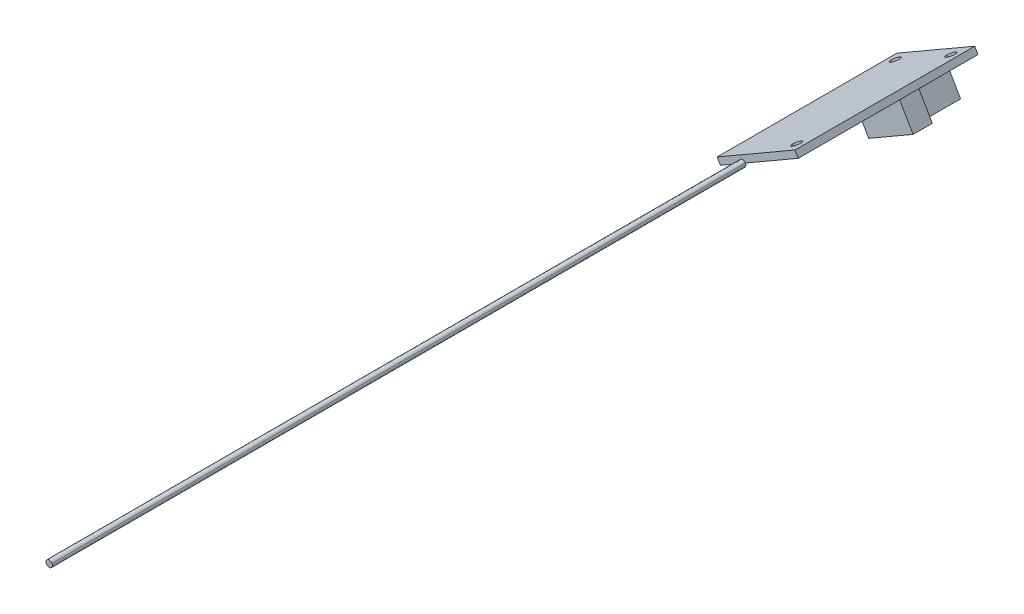
ISO-10303-21;
HEADER;
FILE_DESCRIPTION(('STEP AP214'),'2;1');
FILE_NAME('part.step','',(''),(''),'','','');
FILE_SCHEMA(('AUTOMOTIVE_DESIGN { 1 0 10303 214 1 1 1 1 }'));
ENDSEC;
DATA;
#1=APPLICATION_CONTEXT('core data for automotive mechanical design processes');
#2=APPLICATION_PROTOCOL_DEFINITION('international standard','automotive_design',2000,#1);
#3=PRODUCT_CONTEXT('',#1,'mechanical');
#4=PRODUCT('Part','Part','',(#3));
#5=PRODUCT_RELATED_PRODUCT_CATEGORY('part','',(#4));
#6=PRODUCT_DEFINITION_FORMATION('','',#4);
#7=PRODUCT_DEFINITION_CONTEXT('part definition',#1,'design');
#8=PRODUCT_DEFINITION('design','',#6,#7);
#9=PRODUCT_DEFINITION_SHAPE('','',#8);
#10=(LENGTH_UNIT() NAMED_UNIT(*) SI_UNIT(.MILLI.,.METRE.));
#11=(NAMED_UNIT(*) PLANE_ANGLE_UNIT() SI_UNIT($,.RADIAN.));
#12=(NAMED_UNIT(*) SI_UNIT($,.STERADIAN.) SOLID_ANGLE_UNIT());
#13=UNCERTAINTY_MEASURE_WITH_UNIT(LENGTH_MEASURE(1.E-05),#10,'distance_accuracy_value','');
#14=(GEOMETRIC_REPRESENTATION_CONTEXT(3) GLOBAL_UNCERTAINTY_ASSIGNED_CONTEXT((#13)) GLOBAL_UNIT_ASSIGNED_CONTEXT((#10,
#11,#12)) REPRESENTATION_CONTEXT('',''));
#15=CARTESIAN_POINT('',(0.,0.,0.));
#16=DIRECTION('',(0.,0.,1.));
#17=DIRECTION('',(1.,0.,0.));
#18=AXIS2_PLACEMENT_3D('',#15,#16,#17);
#19=CARTESIAN_POINT('',(35.4347055478842,-27.0847103601782,165.1));
#20=DIRECTION('',(0.,0.,1.));
#21=DIRECTION('',(0.866025403784439,0.5,0.));
#22=AXIS2_PLACEMENT_3D('',#19,#20,#21);
#23=CYLINDRICAL_SURFACE('',#22,0.79375);
#24=CARTESIAN_POINT('',(35.4347055478842,-27.0847103601782,250.825));
#25=DIRECTION('',(0.,0.,-1.));
#26=DIRECTION('',(0.866025403784439,0.5,0.));
#27=AXIS2_PLACEMENT_3D('',#24,#25,#26);
#28=CIRCLE('',#27,0.79375);
#29=CARTESIAN_POINT('',(36.1221132121381,-26.6878353601782,250.825));
#30=VERTEX_POINT('',#29);
#31=CARTESIAN_POINT('',(34.7472978836303,-27.4815853601782,250.825));
#32=VERTEX_POINT('',#31);
#33=EDGE_CURVE('E10',#30,#32,#28,.T.);
#34=ORIENTED_EDGE('',*,*,#33,.T.);
#35=DIRECTION('',(0.,0.,1.));
#36=VECTOR('',#35,1.);
#37=CARTESIAN_POINT('',(34.7472978836303,-27.4815853601782,165.1));
#38=LINE('',#37,#36);
#39=CARTESIAN_POINT('',(34.7472978836303,-27.4815853601782,79.375));
#40=VERTEX_POINT('',#39);
#41=EDGE_CURVE('E42',#40,#32,#38,.T.);
#42=ORIENTED_EDGE('',*,*,#41,.F.);
#43=CARTESIAN_POINT('',(35.4347055478842,-27.0847103601782,79.375));
#44=DIRECTION('',(0.,0.,-1.));
#45=DIRECTION('',(0.866025403784439,0.5,0.));
#46=AXIS2_PLACEMENT_3D('',#43,#44,#45);
#47=CIRCLE('',#46,0.79375);
#48=CARTESIAN_POINT('',(36.1221132121381,-26.6878353601782,79.375));
#49=VERTEX_POINT('',#48);
#50=EDGE_CURVE('E238',#49,#40,#47,.T.);
#51=ORIENTED_EDGE('',*,*,#50,.F.);
#52=DIRECTION('',(0.,0.,1.));
#53=VECTOR('',#52,1.);
#54=CARTESIAN_POINT('',(36.1221132121381,-26.6878353601782,165.1));
#55=LINE('',#54,#53);
#56=EDGE_CURVE('E27',#49,#30,#55,.T.);
#57=ORIENTED_EDGE('',*,*,#56,.T.);
#58=EDGE_LOOP('',(#34,#42,#51,#57));
#59=FACE_BOUND('',#58,.T.);
#60=ADVANCED_FACE('F16',(#59),#23,.T.);
#61=CARTESIAN_POINT('',(35.4347055478842,-27.0847103601782,165.1));
#62=DIRECTION('',(0.,0.,1.));
#63=DIRECTION('',(0.866025403784439,0.5,0.));
#64=AXIS2_PLACEMENT_3D('',#61,#62,#63);
#65=CYLINDRICAL_SURFACE('',#64,0.79375);
#66=CARTESIAN_POINT('',(35.4347055478842,-27.0847103601782,250.825));
#67=DIRECTION('',(0.,0.,-1.));
#68=DIRECTION('',(0.866025403784439,0.5,0.));
#69=AXIS2_PLACEMENT_3D('',#66,#67,#68);
#70=CIRCLE('',#69,0.79375);
#71=EDGE_CURVE('E239',#32,#30,#70,.T.);
#72=ORIENTED_EDGE('',*,*,#71,.T.);
#73=ORIENTED_EDGE('',*,*,#56,.F.);
#74=CARTESIAN_POINT('',(35.4347055478842,-27.0847103601782,79.375));
#75=DIRECTION('',(0.,0.,-1.));
#76=DIRECTION('',(0.866025403784439,0.5,0.));
#77=AXIS2_PLACEMENT_3D('',#74,#75,#76);
#78=CIRCLE('',#77,0.79375);
#79=EDGE_CURVE('E242',#40,#49,#78,.T.);
#80=ORIENTED_EDGE('',*,*,#79,.F.);
#81=ORIENTED_EDGE('',*,*,#41,.T.);
#82=EDGE_LOOP('',(#72,#73,#80,#81));
#83=FACE_BOUND('',#82,.T.);
#84=ADVANCED_FACE('F471',(#83),#65,.T.);
#85=CARTESIAN_POINT('',(48.3827588329622,-17.7613965090424,79.375));
#86=DIRECTION('',(0.,0.,1.));
#87=DIRECTION('',(-0.866025403784439,-0.5,0.));
#88=AXIS2_PLACEMENT_3D('',#85,#86,#87);
#89=PLANE('',#88);
#90=DIRECTION('',(-0.866025403784439,-0.5,0.));
#91=VECTOR('',#90,1.);
#92=CARTESIAN_POINT('',(35.4347055478842,-27.0847103601782,79.375));
#93=LINE('',#92,#91);
#94=EDGE_CURVE('E313',#49,#40,#93,.T.);
#95=ORIENTED_EDGE('',*,*,#94,.F.);
#96=ORIENTED_EDGE('',*,*,#50,.T.);
#97=EDGE_LOOP('',(#95,#96));
#98=FACE_BOUND('',#97,.T.);
#99=ADVANCED_FACE('F805',(#98),#89,.F.);
#100=CARTESIAN_POINT('',(48.3827588329622,-17.7613965090424,250.825));
#101=DIRECTION('',(0.,0.,-1.));
#102=DIRECTION('',(0.866025403784439,0.5,0.));
#103=AXIS2_PLACEMENT_3D('',#100,#101,#102);
#104=PLANE('',#103);
#105=ORIENTED_EDGE('',*,*,#71,.F.);
#106=ORIENTED_EDGE('',*,*,#33,.F.);
#107=EDGE_LOOP('',(#105,#106));
#108=FACE_BOUND('',#107,.T.);
#109=ADVANCED_FACE('F691',(#108),#104,.F.);
#110=CARTESIAN_POINT('',(46.4332281759466,-20.7347103601782,38.1));
#111=DIRECTION('',(0.5,-0.866025403784439,0.));
#112=DIRECTION('',(-0.866025403784439,-0.5,0.));
#113=AXIS2_PLACEMENT_3D('',#110,#111,#112);
#114=CYLINDRICAL_SURFACE('',#113,1.143);
#115=DIRECTION('',(0.5,-0.866025403784439,0.));
#116=VECTOR('',#115,1.);
#117=CARTESIAN_POINT('',(49.0042452124722,-22.9018424945658,38.1));
#118=LINE('',#117,#116);
#119=CARTESIAN_POINT('',(46.6229952124722,-18.7773965090424,38.1));
#120=VERTEX_POINT('',#119);
#121=CARTESIAN_POINT('',(47.4230952124722,-20.1632103601782,38.1));
#122=VERTEX_POINT('',#121);
#123=EDGE_CURVE('E199',#120,#122,#118,.T.);
#124=ORIENTED_EDGE('',*,*,#123,.F.);
#125=CARTESIAN_POINT('',(45.6331281759466,-19.3488965090424,38.1));
#126=DIRECTION('',(0.5,-0.866025403784439,0.));
#127=DIRECTION('',(-0.866025403784439,-0.5,0.));
#128=AXIS2_PLACEMENT_3D('',#125,#126,#127);
#129=CIRCLE('',#128,1.143);
#130=CARTESIAN_POINT('',(44.643261139421,-19.9203965090424,38.1));
#131=VERTEX_POINT('',#130);
#132=EDGE_CURVE('E122',#131,#120,#129,.T.);
#133=ORIENTED_EDGE('',*,*,#132,.F.);
#134=DIRECTION('',(0.5,-0.866025403784439,0.));
#135=VECTOR('',#134,1.);
#136=CARTESIAN_POINT('',(47.024511139421,-24.0448424945658,38.1));
#137=LINE('',#136,#135);
#138=CARTESIAN_POINT('',(45.443361139421,-21.3062103601782,38.1));
#139=VERTEX_POINT('',#138);
#140=EDGE_CURVE('E233',#131,#139,#137,.T.);
#141=ORIENTED_EDGE('',*,*,#140,.T.);
#142=CARTESIAN_POINT('',(46.4332281759466,-20.7347103601782,38.1));
#143=DIRECTION('',(0.5,-0.866025403784439,0.));
#144=DIRECTION('',(-0.866025403784439,-0.5,0.));
#145=AXIS2_PLACEMENT_3D('',#142,#143,#144);
#146=CIRCLE('',#145,1.143);
#147=EDGE_CURVE('E229',#139,#122,#146,.T.);
#148=ORIENTED_EDGE('',*,*,#147,.T.);
#149=EDGE_LOOP('',(#124,#133,#141,#148));
#150=FACE_BOUND('',#149,.T.);
#151=ADVANCED_FACE('F487',(#150),#114,.F.);
#152=CARTESIAN_POINT('',(49.1828588329622,-19.1472103601782,79.375));
#153=DIRECTION('',(0.5,-0.866025403784439,0.));
#154=DIRECTION('',(-0.866025403784439,-0.5,0.));
#155=AXIS2_PLACEMENT_3D('',#152,#153,#154);
#156=PLANE('',#155);
#157=DIRECTION('',(0.866025403784439,0.5,0.));
#158=VECTOR('',#157,1.);
#159=CARTESIAN_POINT('',(45.0474143248107,-21.5348103601782,34.925));
#160=LINE('',#159,#158);
#161=CARTESIAN_POINT('',(40.9119698166593,-23.9224103601782,34.925));
#162=VERTEX_POINT('',#161);
#163=CARTESIAN_POINT('',(49.1828588329622,-19.1472103601782,34.925));
#164=VERTEX_POINT('',#163);
#165=EDGE_CURVE('E234',#162,#164,#160,.T.);
#166=ORIENTED_EDGE('',*,*,#165,.T.);
#167=DIRECTION('',(0.,0.,1.));
#168=VECTOR('',#167,1.);
#169=CARTESIAN_POINT('',(49.1828588329622,-19.1472103601782,57.15));
#170=LINE('',#169,#168);
#171=CARTESIAN_POINT('',(49.1828588329622,-19.1472103601782,79.375));
#172=VERTEX_POINT('',#171);
#173=EDGE_CURVE('E300',#164,#172,#170,.T.);
#174=ORIENTED_EDGE('',*,*,#173,.T.);
#175=DIRECTION('',(-0.866025403784439,-0.5,0.));
#176=VECTOR('',#175,1.);
#177=CARTESIAN_POINT('',(42.6524860225501,-22.9175228601782,79.375));
#178=LINE('',#177,#176);
#179=EDGE_CURVE('E306',#172,#49,#178,.T.);
#180=ORIENTED_EDGE('',*,*,#179,.T.);
#181=ORIENTED_EDGE('',*,*,#94,.T.);
#182=DIRECTION('',(-0.866025403784439,-0.5,0.));
#183=VECTOR('',#182,1.);
#184=CARTESIAN_POINT('',(32.3413710587417,-28.8706478601782,79.375));
#185=LINE('',#184,#183);
#186=CARTESIAN_POINT('',(29.935444233853,-30.2597103601782,79.375));
#187=VERTEX_POINT('',#186);
#188=EDGE_CURVE('E340',#40,#187,#185,.T.);
#189=ORIENTED_EDGE('',*,*,#188,.T.);
#190=DIRECTION('',(0.,0.,-1.));
#191=VECTOR('',#190,1.);
#192=CARTESIAN_POINT('',(29.935444233853,-30.2597103601782,57.15));
#193=LINE('',#192,#191);
#194=CARTESIAN_POINT('',(29.935444233853,-30.2597103601782,34.925));
#195=VERTEX_POINT('',#194);
#196=EDGE_CURVE('E20',#187,#195,#193,.T.);
#197=ORIENTED_EDGE('',*,*,#196,.T.);
#198=DIRECTION('',(0.866025403784439,0.5,0.));
#199=VECTOR('',#198,1.);
#200=CARTESIAN_POINT('',(32.0031664879287,-29.0659103601782,34.925));
#201=LINE('',#200,#199);
#202=CARTESIAN_POINT('',(34.0708887420045,-27.8721103601782,34.925));
#203=VERTEX_POINT('',#202);
#204=EDGE_CURVE('E189',#195,#203,#201,.T.);
#205=ORIENTED_EDGE('',*,*,#204,.T.);
#206=DIRECTION('',(0.,0.,-1.));
#207=VECTOR('',#206,1.);
#208=CARTESIAN_POINT('',(34.0708887420045,-27.8721103601782,42.8625));
#209=LINE('',#208,#207);
#210=CARTESIAN_POINT('',(34.0708887420045,-27.8721103601782,50.8));
#211=VERTEX_POINT('',#210);
#212=EDGE_CURVE('E174',#211,#203,#209,.T.);
#213=ORIENTED_EDGE('',*,*,#212,.F.);
#214=DIRECTION('',(-0.866025403784439,-0.5,0.));
#215=VECTOR('',#214,1.);
#216=CARTESIAN_POINT('',(39.5591515334076,-24.7034603601782,50.8));
#217=LINE('',#216,#215);
#218=CARTESIAN_POINT('',(45.0474143248107,-21.5348103601782,50.8));
#219=VERTEX_POINT('',#218);
#220=EDGE_CURVE('E207',#219,#211,#217,.T.);
#221=ORIENTED_EDGE('',*,*,#220,.F.);
#222=DIRECTION('',(0.,0.,1.));
#223=VECTOR('',#222,1.);
#224=CARTESIAN_POINT('',(45.0474143248107,-21.5348103601782,48.4251));
#225=LINE('',#224,#223);
#226=CARTESIAN_POINT('',(45.0474143248107,-21.5348103601782,46.0502));
#227=VERTEX_POINT('',#226);
#228=EDGE_CURVE('E267',#227,#219,#225,.T.);
#229=ORIENTED_EDGE('',*,*,#228,.F.);
#230=DIRECTION('',(0.866025403784439,0.5,0.));
#231=VECTOR('',#230,1.);
#232=CARTESIAN_POINT('',(42.979692070735,-22.7286103601782,46.0502));
#233=LINE('',#232,#231);
#234=CARTESIAN_POINT('',(40.9119698166593,-23.9224103601782,46.0502));
#235=VERTEX_POINT('',#234);
#236=EDGE_CURVE('E222',#235,#227,#233,.T.);
#237=ORIENTED_EDGE('',*,*,#236,.F.);
#238=DIRECTION('',(0.,0.,1.));
#239=VECTOR('',#238,1.);
#240=CARTESIAN_POINT('',(40.9119698166593,-23.9224103601782,40.4876));
#241=LINE('',#240,#239);
#242=EDGE_CURVE('E223',#162,#235,#241,.T.);
#243=ORIENTED_EDGE('',*,*,#242,.F.);
#244=EDGE_LOOP('',(#166,#174,#180,#181,#189,#197,#205,#213,#221,#229,#237,#243));
#245=FACE_BOUND('',#244,.T.);
#246=CARTESIAN_POINT('',(46.4332281759466,-20.7347103601782,76.2));
#247=DIRECTION('',(0.5,-0.866025403784439,0.));
#248=DIRECTION('',(-0.866025403784439,-0.5,0.));
#249=AXIS2_PLACEMENT_3D('',#246,#247,#248);
#250=CIRCLE('',#249,1.143);
#251=CARTESIAN_POINT('',(45.443361139421,-21.3062103601782,76.2));
#252=VERTEX_POINT('',#251);
#253=CARTESIAN_POINT('',(47.4230952124722,-20.1632103601782,76.2));
#254=VERTEX_POINT('',#253);
#255=EDGE_CURVE('E320',#252,#254,#250,.T.);
#256=ORIENTED_EDGE('',*,*,#255,.F.);
#257=CARTESIAN_POINT('',(46.4332281759466,-20.7347103601782,76.2));
#258=DIRECTION('',(0.5,-0.866025403784439,0.));
#259=DIRECTION('',(-0.866025403784439,-0.5,0.));
#260=AXIS2_PLACEMENT_3D('',#257,#258,#259);
#261=CIRCLE('',#260,1.143);
#262=EDGE_CURVE('E261',#254,#252,#261,.T.);
#263=ORIENTED_EDGE('',*,*,#262,.F.);
#264=EDGE_LOOP('',(#256,#263));
#265=FACE_BOUND('',#264,.T.);
#266=CARTESIAN_POINT('',(32.6850748908686,-28.6722103601782,38.1));
#267=DIRECTION('',(0.5,-0.866025403784439,0.));
#268=DIRECTION('',(-0.866025403784439,-0.5,0.));
#269=AXIS2_PLACEMENT_3D('',#266,#267,#268);
#270=CIRCLE('',#269,1.143);
#271=CARTESIAN_POINT('',(31.695207854343,-29.2437103601782,38.1));
#272=VERTEX_POINT('',#271);
#273=CARTESIAN_POINT('',(33.6749419273942,-28.1007103601782,38.1));
#274=VERTEX_POINT('',#273);
#275=EDGE_CURVE('E216',#272,#274,#270,.T.);
#276=ORIENTED_EDGE('',*,*,#275,.F.);
#277=CARTESIAN_POINT('',(32.6850748908686,-28.6722103601782,38.1));
#278=DIRECTION('',(0.5,-0.866025403784439,0.));
#279=DIRECTION('',(-0.866025403784439,-0.5,0.));
#280=AXIS2_PLACEMENT_3D('',#277,#278,#279);
#281=CIRCLE('',#280,1.143);
#282=EDGE_CURVE('E249',#274,#272,#281,.T.);
#283=ORIENTED_EDGE('',*,*,#282,.F.);
#284=EDGE_LOOP('',(#276,#283));
#285=FACE_BOUND('',#284,.T.);
#286=CARTESIAN_POINT('',(46.4332281759466,-20.7347103601782,38.1));
#287=DIRECTION('',(0.5,-0.866025403784439,0.));
#288=DIRECTION('',(-0.866025403784439,-0.5,0.));
#289=AXIS2_PLACEMENT_3D('',#286,#287,#288);
#290=CIRCLE('',#289,1.143);
#291=EDGE_CURVE('E343',#122,#139,#290,.T.);
#292=ORIENTED_EDGE('',*,*,#291,.F.);
#293=ORIENTED_EDGE('',*,*,#147,.F.);
#294=EDGE_LOOP('',(#292,#293));
#295=FACE_BOUND('',#294,.T.);
#296=ADVANCED_FACE('F192',(#245,#265,#285,#295),#156,.T.);
#297=CARTESIAN_POINT('',(46.4332281759466,-20.7347103601782,38.1));
#298=DIRECTION('',(0.5,-0.866025403784439,0.));
#299=DIRECTION('',(-0.866025403784439,-0.5,0.));
#300=AXIS2_PLACEMENT_3D('',#297,#298,#299);
#301=CYLINDRICAL_SURFACE('',#300,1.143);
#302=ORIENTED_EDGE('',*,*,#140,.F.);
#303=CARTESIAN_POINT('',(45.6331281759466,-19.3488965090424,38.1));
#304=DIRECTION('',(0.5,-0.866025403784439,0.));
#305=DIRECTION('',(-0.866025403784439,-0.5,0.));
#306=AXIS2_PLACEMENT_3D('',#303,#304,#305);
#307=CIRCLE('',#306,1.143);
#308=EDGE_CURVE('E362',#120,#131,#307,.T.);
#309=ORIENTED_EDGE('',*,*,#308,.F.);
#310=ORIENTED_EDGE('',*,*,#123,.T.);
#311=ORIENTED_EDGE('',*,*,#291,.T.);
#312=EDGE_LOOP('',(#302,#309,#310,#311));
#313=FACE_BOUND('',#312,.T.);
#314=ADVANCED_FACE('F421',(#313),#301,.F.);
#315=CARTESIAN_POINT('',(48.3827588329622,-17.7613965090424,79.375));
#316=DIRECTION('',(0.5,-0.866025403784439,0.));
#317=DIRECTION('',(-0.866025403784439,-0.5,0.));
#318=AXIS2_PLACEMENT_3D('',#315,#316,#317);
#319=PLANE('',#318);
#320=DIRECTION('',(0.,0.,1.));
#321=VECTOR('',#320,1.);
#322=CARTESIAN_POINT('',(48.3827588329622,-17.7613965090424,57.15));
#323=LINE('',#322,#321);
#324=CARTESIAN_POINT('',(48.3827588329622,-17.7613965090424,34.925));
#325=VERTEX_POINT('',#324);
#326=CARTESIAN_POINT('',(48.3827588329622,-17.7613965090424,79.375));
#327=VERTEX_POINT('',#326);
#328=EDGE_CURVE('E228',#325,#327,#323,.T.);
#329=ORIENTED_EDGE('',*,*,#328,.F.);
#330=DIRECTION('',(0.866025403784439,0.5,0.));
#331=VECTOR('',#330,1.);
#332=CARTESIAN_POINT('',(38.7590515334076,-23.3176465090424,34.925));
#333=LINE('',#332,#331);
#334=CARTESIAN_POINT('',(29.135344233853,-28.8738965090424,34.925));
#335=VERTEX_POINT('',#334);
#336=EDGE_CURVE('E257',#335,#325,#333,.T.);
#337=ORIENTED_EDGE('',*,*,#336,.F.);
#338=DIRECTION('',(0.,0.,-1.));
#339=VECTOR('',#338,1.);
#340=CARTESIAN_POINT('',(29.135344233853,-28.8738965090424,57.15));
#341=LINE('',#340,#339);
#342=CARTESIAN_POINT('',(29.135344233853,-28.8738965090424,79.375));
#343=VERTEX_POINT('',#342);
#344=EDGE_CURVE('E246',#343,#335,#341,.T.);
#345=ORIENTED_EDGE('',*,*,#344,.F.);
#346=DIRECTION('',(-0.866025403784439,-0.5,0.));
#347=VECTOR('',#346,1.);
#348=CARTESIAN_POINT('',(38.7590515334076,-23.3176465090424,79.375));
#349=LINE('',#348,#347);
#350=EDGE_CURVE('E295',#327,#343,#349,.T.);
#351=ORIENTED_EDGE('',*,*,#350,.F.);
#352=EDGE_LOOP('',(#329,#337,#345,#351));
#353=FACE_BOUND('',#352,.T.);
#354=CARTESIAN_POINT('',(45.6331281759466,-19.3488965090424,76.2));
#355=DIRECTION('',(0.5,-0.866025403784439,0.));
#356=DIRECTION('',(-0.866025403784439,-0.5,0.));
#357=AXIS2_PLACEMENT_3D('',#354,#355,#356);
#358=CIRCLE('',#357,1.143);
#359=CARTESIAN_POINT('',(46.6229952124722,-18.7773965090424,76.2));
#360=VERTEX_POINT('',#359);
#361=CARTESIAN_POINT('',(44.643261139421,-19.9203965090424,76.2));
#362=VERTEX_POINT('',#361);
#363=EDGE_CURVE('E347',#360,#362,#358,.T.);
#364=ORIENTED_EDGE('',*,*,#363,.T.);
#365=CARTESIAN_POINT('',(45.6331281759466,-19.3488965090424,76.2));
#366=DIRECTION('',(0.5,-0.866025403784439,0.));
#367=DIRECTION('',(-0.866025403784439,-0.5,0.));
#368=AXIS2_PLACEMENT_3D('',#365,#366,#367);
#369=CIRCLE('',#368,1.143);
#370=EDGE_CURVE('E352',#362,#360,#369,.T.);
#371=ORIENTED_EDGE('',*,*,#370,.T.);
#372=EDGE_LOOP('',(#364,#371));
#373=FACE_BOUND('',#372,.T.);
#374=CARTESIAN_POINT('',(31.8849748908686,-27.2863965090424,38.1));
#375=DIRECTION('',(0.5,-0.866025403784439,0.));
#376=DIRECTION('',(-0.866025403784439,-0.5,0.));
#377=AXIS2_PLACEMENT_3D('',#374,#375,#376);
#378=CIRCLE('',#377,1.143);
#379=CARTESIAN_POINT('',(32.8748419273942,-26.7148965090424,38.1));
#380=VERTEX_POINT('',#379);
#381=CARTESIAN_POINT('',(30.895107854343,-27.8578965090424,38.1));
#382=VERTEX_POINT('',#381);
#383=EDGE_CURVE('E348',#380,#382,#378,.T.);
#384=ORIENTED_EDGE('',*,*,#383,.T.);
#385=CARTESIAN_POINT('',(31.8849748908686,-27.2863965090424,38.1));
#386=DIRECTION('',(0.5,-0.866025403784439,0.));
#387=DIRECTION('',(-0.866025403784439,-0.5,0.));
#388=AXIS2_PLACEMENT_3D('',#385,#386,#387);
#389=CIRCLE('',#388,1.143);
#390=EDGE_CURVE('E353',#382,#380,#389,.T.);
#391=ORIENTED_EDGE('',*,*,#390,.T.);
#392=EDGE_LOOP('',(#384,#391));
#393=FACE_BOUND('',#392,.T.);
#394=ORIENTED_EDGE('',*,*,#132,.T.);
#395=ORIENTED_EDGE('',*,*,#308,.T.);
#396=EDGE_LOOP('',(#394,#395));
#397=FACE_BOUND('',#396,.T.);
#398=ADVANCED_FACE('F416',(#353,#373,#393,#397),#319,.F.);
#399=CARTESIAN_POINT('',(29.135344233853,-28.8738965090424,34.925));
#400=DIRECTION('',(0.,0.,-1.));
#401=DIRECTION('',(0.866025403784439,0.5,0.));
#402=AXIS2_PLACEMENT_3D('',#399,#400,#401);
#403=PLANE('',#402);
#404=DIRECTION('',(0.5,-0.866025403784439,0.));
#405=VECTOR('',#404,1.);
#406=CARTESIAN_POINT('',(36.0520887420045,-31.3036494201337,34.925));
#407=LINE('',#406,#405);
#408=CARTESIAN_POINT('',(38.0332887420045,-34.7351884800891,34.925));
#409=VERTEX_POINT('',#408);
#410=EDGE_CURVE('E179',#203,#409,#407,.T.);
#411=ORIENTED_EDGE('',*,*,#410,.F.);
#412=ORIENTED_EDGE('',*,*,#204,.F.);
#413=DIRECTION('',(0.5,-0.866025403784439,0.));
#414=VECTOR('',#413,1.);
#415=CARTESIAN_POINT('',(29.535394233853,-29.5668034346103,34.925));
#416=LINE('',#415,#414);
#417=EDGE_CURVE('E186',#335,#195,#416,.T.);
#418=ORIENTED_EDGE('',*,*,#417,.F.);
#419=ORIENTED_EDGE('',*,*,#336,.T.);
#420=DIRECTION('',(0.5,-0.866025403784439,0.));
#421=VECTOR('',#420,1.);
#422=CARTESIAN_POINT('',(48.7828088329622,-18.4543034346103,34.925));
#423=LINE('',#422,#421);
#424=EDGE_CURVE('E227',#325,#164,#423,.T.);
#425=ORIENTED_EDGE('',*,*,#424,.T.);
#426=ORIENTED_EDGE('',*,*,#165,.F.);
#427=DIRECTION('',(0.5,-0.866025403784439,0.));
#428=VECTOR('',#427,1.);
#429=CARTESIAN_POINT('',(42.8931698166593,-27.3539494201337,34.925));
#430=LINE('',#429,#428);
#431=CARTESIAN_POINT('',(44.8743698166593,-30.7854884800891,34.925));
#432=VERTEX_POINT('',#431);
#433=EDGE_CURVE('E224',#162,#432,#430,.T.);
#434=ORIENTED_EDGE('',*,*,#433,.T.);
#435=DIRECTION('',(0.866025403784439,0.5,0.));
#436=VECTOR('',#435,1.);
#437=CARTESIAN_POINT('',(41.4538292793319,-32.7603384800891,34.925));
#438=LINE('',#437,#436);
#439=EDGE_CURVE('E205',#409,#432,#438,.T.);
#440=ORIENTED_EDGE('',*,*,#439,.F.);
#441=EDGE_LOOP('',(#411,#412,#418,#419,#425,#426,#434,#440));
#442=FACE_BOUND('',#441,.T.);
#443=ADVANCED_FACE('F203',(#442),#403,.T.);
#444=CARTESIAN_POINT('',(48.3827588329622,-17.7613965090424,34.925));
#445=DIRECTION('',(0.866025403784439,0.5,0.));
#446=DIRECTION('',(0.,0.,1.));
#447=AXIS2_PLACEMENT_3D('',#444,#445,#446);
#448=PLANE('',#447);
#449=ORIENTED_EDGE('',*,*,#424,.F.);
#450=ORIENTED_EDGE('',*,*,#328,.T.);
#451=DIRECTION('',(0.5,-0.866025403784439,0.));
#452=VECTOR('',#451,1.);
#453=CARTESIAN_POINT('',(48.7828088329622,-18.4543034346103,79.375));
#454=LINE('',#453,#452);
#455=EDGE_CURVE('E298',#327,#172,#454,.T.);
#456=ORIENTED_EDGE('',*,*,#455,.T.);
#457=ORIENTED_EDGE('',*,*,#173,.F.);
#458=EDGE_LOOP('',(#449,#450,#456,#457));
#459=FACE_BOUND('',#458,.T.);
#460=ADVANCED_FACE('F477',(#459),#448,.T.);
#461=CARTESIAN_POINT('',(48.3827588329622,-17.7613965090424,79.375));
#462=DIRECTION('',(0.,0.,1.));
#463=DIRECTION('',(-0.866025403784439,-0.5,0.));
#464=AXIS2_PLACEMENT_3D('',#461,#462,#463);
#465=PLANE('',#464);
#466=ORIENTED_EDGE('',*,*,#179,.F.);
#467=ORIENTED_EDGE('',*,*,#455,.F.);
#468=ORIENTED_EDGE('',*,*,#350,.T.);
#469=DIRECTION('',(0.5,-0.866025403784439,0.));
#470=VECTOR('',#469,1.);
#471=CARTESIAN_POINT('',(29.535394233853,-29.5668034346103,79.375));
#472=LINE('',#471,#470);
#473=EDGE_CURVE('E245',#343,#187,#472,.T.);
#474=ORIENTED_EDGE('',*,*,#473,.T.);
#475=ORIENTED_EDGE('',*,*,#188,.F.);
#476=ORIENTED_EDGE('',*,*,#79,.T.);
#477=EDGE_LOOP('',(#466,#467,#468,#474,#475,#476));
#478=FACE_BOUND('',#477,.T.);
#479=ADVANCED_FACE('F512',(#478),#465,.T.);
#480=CARTESIAN_POINT('',(29.135344233853,-28.8738965090424,79.375));
#481=DIRECTION('',(-0.866025403784439,-0.5,0.));
#482=DIRECTION('',(0.,0.,-1.));
#483=AXIS2_PLACEMENT_3D('',#480,#481,#482);
#484=PLANE('',#483);
#485=ORIENTED_EDGE('',*,*,#473,.F.);
#486=ORIENTED_EDGE('',*,*,#344,.T.);
#487=ORIENTED_EDGE('',*,*,#417,.T.);
#488=ORIENTED_EDGE('',*,*,#196,.F.);
#489=EDGE_LOOP('',(#485,#486,#487,#488));
#490=FACE_BOUND('',#489,.T.);
#491=ADVANCED_FACE('F816',(#490),#484,.T.);
#492=CARTESIAN_POINT('',(34.0708887420045,-27.8721103601782,50.8));
#493=DIRECTION('',(-0.866025403784439,-0.5,0.));
#494=DIRECTION('',(0.,0.,-1.));
#495=AXIS2_PLACEMENT_3D('',#492,#493,#494);
#496=PLANE('',#495);
#497=DIRECTION('',(0.5,-0.866025403784439,0.));
#498=VECTOR('',#497,1.);
#499=CARTESIAN_POINT('',(36.0520887420045,-31.3036494201337,50.8));
#500=LINE('',#499,#498);
#501=CARTESIAN_POINT('',(38.0332887420045,-34.7351884800891,50.8));
#502=VERTEX_POINT('',#501);
#503=EDGE_CURVE('E182',#211,#502,#500,.T.);
#504=ORIENTED_EDGE('',*,*,#503,.F.);
#505=ORIENTED_EDGE('',*,*,#212,.T.);
#506=ORIENTED_EDGE('',*,*,#410,.T.);
#507=DIRECTION('',(0.,0.,-1.));
#508=VECTOR('',#507,1.);
#509=CARTESIAN_POINT('',(38.0332887420045,-34.7351884800891,42.8625));
#510=LINE('',#509,#508);
#511=EDGE_CURVE('E273',#502,#409,#510,.T.);
#512=ORIENTED_EDGE('',*,*,#511,.F.);
#513=EDGE_LOOP('',(#504,#505,#506,#512));
#514=FACE_BOUND('',#513,.T.);
#515=ADVANCED_FACE('F177',(#514),#496,.T.);
#516=CARTESIAN_POINT('',(45.0474143248107,-21.5348103601782,50.8));
#517=DIRECTION('',(0.,0.,1.));
#518=DIRECTION('',(-0.866025403784439,-0.5,0.));
#519=AXIS2_PLACEMENT_3D('',#516,#517,#518);
#520=PLANE('',#519);
#521=DIRECTION('',(0.5,-0.866025403784439,0.));
#522=VECTOR('',#521,1.);
#523=CARTESIAN_POINT('',(47.0286143248107,-24.9663494201337,50.8));
#524=LINE('',#523,#522);
#525=CARTESIAN_POINT('',(49.0098143248107,-28.3978884800891,50.8));
#526=VERTEX_POINT('',#525);
#527=EDGE_CURVE('E277',#219,#526,#524,.T.);
#528=ORIENTED_EDGE('',*,*,#527,.F.);
#529=ORIENTED_EDGE('',*,*,#220,.T.);
#530=ORIENTED_EDGE('',*,*,#503,.T.);
#531=DIRECTION('',(-0.866025403784439,-0.5,0.));
#532=VECTOR('',#531,1.);
#533=CARTESIAN_POINT('',(43.5215515334076,-31.5665384800891,50.8));
#534=LINE('',#533,#532);
#535=EDGE_CURVE('E291',#526,#502,#534,.T.);
#536=ORIENTED_EDGE('',*,*,#535,.F.);
#537=EDGE_LOOP('',(#528,#529,#530,#536));
#538=FACE_BOUND('',#537,.T.);
#539=ADVANCED_FACE('F455',(#538),#520,.T.);
#540=CARTESIAN_POINT('',(45.0474143248107,-21.5348103601782,46.0502));
#541=DIRECTION('',(0.866025403784439,0.5,0.));
#542=DIRECTION('',(0.,0.,1.));
#543=AXIS2_PLACEMENT_3D('',#540,#541,#542);
#544=PLANE('',#543);
#545=DIRECTION('',(0.5,-0.866025403784439,0.));
#546=VECTOR('',#545,1.);
#547=CARTESIAN_POINT('',(47.0286143248107,-24.9663494201337,46.0502));
#548=LINE('',#547,#546);
#549=CARTESIAN_POINT('',(49.0098143248107,-28.3978884800891,46.0502));
#550=VERTEX_POINT('',#549);
#551=EDGE_CURVE('E218',#227,#550,#548,.T.);
#552=ORIENTED_EDGE('',*,*,#551,.F.);
#553=ORIENTED_EDGE('',*,*,#228,.T.);
#554=ORIENTED_EDGE('',*,*,#527,.T.);
#555=DIRECTION('',(0.,0.,1.));
#556=VECTOR('',#555,1.);
#557=CARTESIAN_POINT('',(49.0098143248107,-28.3978884800891,48.4251));
#558=LINE('',#557,#556);
#559=EDGE_CURVE('E290',#550,#526,#558,.T.);
#560=ORIENTED_EDGE('',*,*,#559,.F.);
#561=EDGE_LOOP('',(#552,#553,#554,#560));
#562=FACE_BOUND('',#561,.T.);
#563=ADVANCED_FACE('F448',(#562),#544,.T.);
#564=CARTESIAN_POINT('',(40.9119698166593,-23.9224103601782,46.0502));
#565=DIRECTION('',(0.,0.,-1.));
#566=DIRECTION('',(0.866025403784439,0.5,0.));
#567=AXIS2_PLACEMENT_3D('',#564,#565,#566);
#568=PLANE('',#567);
#569=DIRECTION('',(0.5,-0.866025403784439,0.));
#570=VECTOR('',#569,1.);
#571=CARTESIAN_POINT('',(42.8931698166593,-27.3539494201337,46.0502));
#572=LINE('',#571,#570);
#573=CARTESIAN_POINT('',(44.8743698166593,-30.7854884800891,46.0502));
#574=VERTEX_POINT('',#573);
#575=EDGE_CURVE('E270',#235,#574,#572,.T.);
#576=ORIENTED_EDGE('',*,*,#575,.F.);
#577=ORIENTED_EDGE('',*,*,#236,.T.);
#578=ORIENTED_EDGE('',*,*,#551,.T.);
#579=DIRECTION('',(0.866025403784439,0.5,0.));
#580=VECTOR('',#579,1.);
#581=CARTESIAN_POINT('',(46.942092070735,-29.5916884800891,46.0502));
#582=LINE('',#581,#580);
#583=EDGE_CURVE('E286',#574,#550,#582,.T.);
#584=ORIENTED_EDGE('',*,*,#583,.F.);
#585=EDGE_LOOP('',(#576,#577,#578,#584));
#586=FACE_BOUND('',#585,.T.);
#587=ADVANCED_FACE('F441',(#586),#568,.T.);
#588=CARTESIAN_POINT('',(40.9119698166593,-23.9224103601782,34.925));
#589=DIRECTION('',(0.866025403784439,0.5,0.));
#590=DIRECTION('',(0.,0.,1.));
#591=AXIS2_PLACEMENT_3D('',#588,#589,#590);
#592=PLANE('',#591);
#593=ORIENTED_EDGE('',*,*,#433,.F.);
#594=ORIENTED_EDGE('',*,*,#242,.T.);
#595=ORIENTED_EDGE('',*,*,#575,.T.);
#596=DIRECTION('',(0.,0.,1.));
#597=VECTOR('',#596,1.);
#598=CARTESIAN_POINT('',(44.8743698166593,-30.7854884800891,40.4876));
#599=LINE('',#598,#597);
#600=EDGE_CURVE('E253',#432,#574,#599,.T.);
#601=ORIENTED_EDGE('',*,*,#600,.F.);
#602=EDGE_LOOP('',(#593,#594,#595,#601));
#603=FACE_BOUND('',#602,.T.);
#604=ADVANCED_FACE('F709',(#603),#592,.T.);
#605=CARTESIAN_POINT('',(46.4332281759466,-20.7347103601782,76.2));
#606=DIRECTION('',(0.5,-0.866025403784439,0.));
#607=DIRECTION('',(-0.866025403784439,-0.5,0.));
#608=AXIS2_PLACEMENT_3D('',#605,#606,#607);
#609=CYLINDRICAL_SURFACE('',#608,1.143);
#610=DIRECTION('',(0.5,-0.866025403784439,0.));
#611=VECTOR('',#610,1.);
#612=CARTESIAN_POINT('',(49.0042452124722,-22.9018424945658,76.2));
#613=LINE('',#612,#611);
#614=EDGE_CURVE('E285',#360,#254,#613,.T.);
#615=ORIENTED_EDGE('',*,*,#614,.F.);
#616=ORIENTED_EDGE('',*,*,#370,.F.);
#617=DIRECTION('',(0.5,-0.866025403784439,0.));
#618=VECTOR('',#617,1.);
#619=CARTESIAN_POINT('',(47.024511139421,-24.0448424945658,76.2));
#620=LINE('',#619,#618);
#621=EDGE_CURVE('E281',#362,#252,#620,.T.);
#622=ORIENTED_EDGE('',*,*,#621,.T.);
#623=ORIENTED_EDGE('',*,*,#255,.T.);
#624=EDGE_LOOP('',(#615,#616,#622,#623));
#625=FACE_BOUND('',#624,.T.);
#626=ADVANCED_FACE('F713',(#625),#609,.F.);
#627=CARTESIAN_POINT('',(46.4332281759466,-20.7347103601782,76.2));
#628=DIRECTION('',(0.5,-0.866025403784439,0.));
#629=DIRECTION('',(-0.866025403784439,-0.5,0.));
#630=AXIS2_PLACEMENT_3D('',#627,#628,#629);
#631=CYLINDRICAL_SURFACE('',#630,1.143);
#632=ORIENTED_EDGE('',*,*,#621,.F.);
#633=ORIENTED_EDGE('',*,*,#363,.F.);
#634=ORIENTED_EDGE('',*,*,#614,.T.);
#635=ORIENTED_EDGE('',*,*,#262,.T.);
#636=EDGE_LOOP('',(#632,#633,#634,#635));
#637=FACE_BOUND('',#636,.T.);
#638=ADVANCED_FACE('F494',(#637),#631,.F.);
#639=CARTESIAN_POINT('',(32.6850748908686,-28.6722103601782,38.1));
#640=DIRECTION('',(0.5,-0.866025403784439,0.));
#641=DIRECTION('',(-0.866025403784439,-0.5,0.));
#642=AXIS2_PLACEMENT_3D('',#639,#640,#641);
#643=CYLINDRICAL_SURFACE('',#642,1.143);
#644=DIRECTION('',(0.5,-0.866025403784439,0.));
#645=VECTOR('',#644,1.);
#646=CARTESIAN_POINT('',(35.2560919273942,-30.8393424945657,38.1));
#647=LINE('',#646,#645);
#648=EDGE_CURVE('E252',#380,#274,#647,.T.);
#649=ORIENTED_EDGE('',*,*,#648,.F.);
#650=ORIENTED_EDGE('',*,*,#390,.F.);
#651=DIRECTION('',(0.5,-0.866025403784439,0.));
#652=VECTOR('',#651,1.);
#653=CARTESIAN_POINT('',(33.276357854343,-31.9823424945657,38.1));
#654=LINE('',#653,#652);
#655=EDGE_CURVE('E258',#382,#272,#654,.T.);
#656=ORIENTED_EDGE('',*,*,#655,.T.);
#657=ORIENTED_EDGE('',*,*,#275,.T.);
#658=EDGE_LOOP('',(#649,#650,#656,#657));
#659=FACE_BOUND('',#658,.T.);
#660=ADVANCED_FACE('F405',(#659),#643,.F.);
#661=CARTESIAN_POINT('',(32.6850748908686,-28.6722103601782,38.1));
#662=DIRECTION('',(0.5,-0.866025403784439,0.));
#663=DIRECTION('',(-0.866025403784439,-0.5,0.));
#664=AXIS2_PLACEMENT_3D('',#661,#662,#663);
#665=CYLINDRICAL_SURFACE('',#664,1.143);
#666=ORIENTED_EDGE('',*,*,#655,.F.);
#667=ORIENTED_EDGE('',*,*,#383,.F.);
#668=ORIENTED_EDGE('',*,*,#648,.T.);
#669=ORIENTED_EDGE('',*,*,#282,.T.);
#670=EDGE_LOOP('',(#666,#667,#668,#669));
#671=FACE_BOUND('',#670,.T.);
#672=ADVANCED_FACE('F411',(#671),#665,.F.);
#673=CARTESIAN_POINT('',(53.1452588329622,-26.0102884800891,79.375));
#674=DIRECTION('',(0.5,-0.866025403784439,0.));
#675=DIRECTION('',(-0.866025403784439,-0.5,0.));
#676=AXIS2_PLACEMENT_3D('',#673,#674,#675);
#677=PLANE('',#676);
#678=ORIENTED_EDGE('',*,*,#600,.T.);
#679=ORIENTED_EDGE('',*,*,#583,.T.);
#680=ORIENTED_EDGE('',*,*,#559,.T.);
#681=ORIENTED_EDGE('',*,*,#535,.T.);
#682=ORIENTED_EDGE('',*,*,#511,.T.);
#683=ORIENTED_EDGE('',*,*,#439,.T.);
#684=EDGE_LOOP('',(#678,#679,#680,#681,#682,#683));
#685=FACE_BOUND('',#684,.T.);
#686=ADVANCED_FACE('F18',(#685),#677,.T.);
#687=CLOSED_SHELL('',(#60,#84,#99,#109,#151,#296,#314,#398,#443,#460,#479,#491,#515,#539,#563,
#587,#604,#626,#638,#660,#672,#686));
#688=MANIFOLD_SOLID_BREP('B1',#687);
#689=ADVANCED_BREP_SHAPE_REPRESENTATION('',(#18,#688),#14);
#690=SHAPE_DEFINITION_REPRESENTATION(#9,#689);
ENDSEC;
END-ISO-10303-21;
